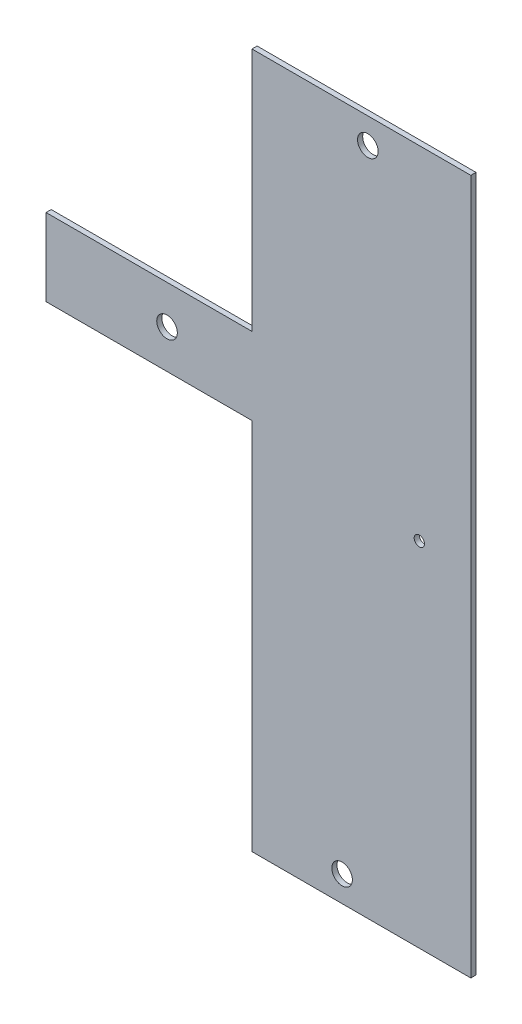
ISO-10303-21;
HEADER;
FILE_DESCRIPTION(('STEP AP214'),'2;1');
FILE_NAME('part.step','',(''),(''),'','','');
FILE_SCHEMA(('AUTOMOTIVE_DESIGN { 1 0 10303 214 1 1 1 1 }'));
ENDSEC;
DATA;
#1=APPLICATION_CONTEXT('core data for automotive mechanical design processes');
#2=APPLICATION_PROTOCOL_DEFINITION('international standard','automotive_design',2000,#1);
#3=PRODUCT_CONTEXT('',#1,'mechanical');
#4=PRODUCT('Part','Part','',(#3));
#5=PRODUCT_RELATED_PRODUCT_CATEGORY('part','',(#4));
#6=PRODUCT_DEFINITION_FORMATION('','',#4);
#7=PRODUCT_DEFINITION_CONTEXT('part definition',#1,'design');
#8=PRODUCT_DEFINITION('design','',#6,#7);
#9=PRODUCT_DEFINITION_SHAPE('','',#8);
#10=(LENGTH_UNIT() NAMED_UNIT(*) SI_UNIT(.MILLI.,.METRE.));
#11=(NAMED_UNIT(*) PLANE_ANGLE_UNIT() SI_UNIT($,.RADIAN.));
#12=(NAMED_UNIT(*) SI_UNIT($,.STERADIAN.) SOLID_ANGLE_UNIT());
#13=UNCERTAINTY_MEASURE_WITH_UNIT(LENGTH_MEASURE(1.E-05),#10,'distance_accuracy_value','');
#14=(GEOMETRIC_REPRESENTATION_CONTEXT(3) GLOBAL_UNCERTAINTY_ASSIGNED_CONTEXT((#13)) GLOBAL_UNIT_ASSIGNED_CONTEXT((#10,
#11,#12)) REPRESENTATION_CONTEXT('',''));
#15=CARTESIAN_POINT('',(0.,0.,0.));
#16=DIRECTION('',(0.,0.,1.));
#17=DIRECTION('',(1.,0.,0.));
#18=AXIS2_PLACEMENT_3D('',#15,#16,#17);
#19=CARTESIAN_POINT('',(-70.0488024936977,-15.3968397565747,2.));
#20=DIRECTION('',(1.,0.,0.));
#21=DIRECTION('',(0.,0.,-1.));
#22=AXIS2_PLACEMENT_3D('',#19,#20,#21);
#23=PLANE('',#22);
#24=DIRECTION('',(0.,-1.,0.));
#25=VECTOR('',#24,1.);
#26=CARTESIAN_POINT('',(-70.0488024936977,-15.3968397565747,0.));
#27=LINE('',#26,#25);
#28=CARTESIAN_POINT('',(-70.0488024936977,14.6031602434253,0.));
#29=VERTEX_POINT('',#28);
#30=CARTESIAN_POINT('',(-70.0488024936977,-15.3968397565747,0.));
#31=VERTEX_POINT('',#30);
#32=EDGE_CURVE('E129',#29,#31,#27,.T.);
#33=ORIENTED_EDGE('',*,*,#32,.T.);
#34=DIRECTION('',(0.,0.,-1.));
#35=VECTOR('',#34,1.);
#36=CARTESIAN_POINT('',(-70.0488024936977,-15.3968397565747,2.));
#37=LINE('',#36,#35);
#38=CARTESIAN_POINT('',(-70.0488024936977,-15.3968397565747,2.));
#39=VERTEX_POINT('',#38);
#40=EDGE_CURVE('E11',#39,#31,#37,.T.);
#41=ORIENTED_EDGE('',*,*,#40,.F.);
#42=DIRECTION('',(0.,-1.,0.));
#43=VECTOR('',#42,1.);
#44=CARTESIAN_POINT('',(-70.0488024936977,-15.3968397565747,2.));
#45=LINE('',#44,#43);
#46=CARTESIAN_POINT('',(-70.0488024936977,14.6031602434253,2.));
#47=VERTEX_POINT('',#46);
#48=EDGE_CURVE('E144',#47,#39,#45,.T.);
#49=ORIENTED_EDGE('',*,*,#48,.F.);
#50=DIRECTION('',(0.,0.,-1.));
#51=VECTOR('',#50,1.);
#52=CARTESIAN_POINT('',(-70.0488024936977,14.6031602434253,2.));
#53=LINE('',#52,#51);
#54=EDGE_CURVE('E125',#47,#29,#53,.T.);
#55=ORIENTED_EDGE('',*,*,#54,.T.);
#56=EDGE_LOOP('',(#33,#41,#49,#55));
#57=FACE_BOUND('',#56,.T.);
#58=ADVANCED_FACE('F33',(#57),#23,.F.);
#59=CARTESIAN_POINT('',(9.95119750630227,-15.3968397565747,2.));
#60=DIRECTION('',(0.,1.,0.));
#61=DIRECTION('',(-1.,0.,0.));
#62=AXIS2_PLACEMENT_3D('',#59,#60,#61);
#63=PLANE('',#62);
#64=DIRECTION('',(1.,0.,0.));
#65=VECTOR('',#64,1.);
#66=CARTESIAN_POINT('',(9.95119750630227,-15.3968397565747,0.));
#67=LINE('',#66,#65);
#68=CARTESIAN_POINT('',(9.95119750630227,-15.3968397565747,0.));
#69=VERTEX_POINT('',#68);
#70=EDGE_CURVE('E132',#31,#69,#67,.T.);
#71=ORIENTED_EDGE('',*,*,#70,.T.);
#72=DIRECTION('',(0.,0.,-1.));
#73=VECTOR('',#72,1.);
#74=CARTESIAN_POINT('',(9.95119750630227,-15.3968397565747,2.));
#75=LINE('',#74,#73);
#76=CARTESIAN_POINT('',(9.95119750630227,-15.3968397565747,2.));
#77=VERTEX_POINT('',#76);
#78=EDGE_CURVE('E41',#77,#69,#75,.T.);
#79=ORIENTED_EDGE('',*,*,#78,.F.);
#80=DIRECTION('',(1.,0.,0.));
#81=VECTOR('',#80,1.);
#82=CARTESIAN_POINT('',(9.95119750630227,-15.3968397565747,2.));
#83=LINE('',#82,#81);
#84=EDGE_CURVE('E92',#39,#77,#83,.T.);
#85=ORIENTED_EDGE('',*,*,#84,.F.);
#86=ORIENTED_EDGE('',*,*,#40,.T.);
#87=EDGE_LOOP('',(#71,#79,#85,#86));
#88=FACE_BOUND('',#87,.T.);
#89=ADVANCED_FACE('F232',(#88),#63,.F.);
#90=CARTESIAN_POINT('',(9.95119750630227,-160.396839756575,2.));
#91=DIRECTION('',(1.,0.,0.));
#92=DIRECTION('',(0.,0.,-1.));
#93=AXIS2_PLACEMENT_3D('',#90,#91,#92);
#94=PLANE('',#93);
#95=DIRECTION('',(0.,-1.,0.));
#96=VECTOR('',#95,1.);
#97=CARTESIAN_POINT('',(9.95119750630227,-160.396839756575,0.));
#98=LINE('',#97,#96);
#99=CARTESIAN_POINT('',(9.95119750630227,-160.396839756575,0.));
#100=VERTEX_POINT('',#99);
#101=EDGE_CURVE('E135',#69,#100,#98,.T.);
#102=ORIENTED_EDGE('',*,*,#101,.T.);
#103=DIRECTION('',(0.,0.,-1.));
#104=VECTOR('',#103,1.);
#105=CARTESIAN_POINT('',(9.95119750630227,-160.396839756575,2.));
#106=LINE('',#105,#104);
#107=CARTESIAN_POINT('',(9.95119750630227,-160.396839756575,2.));
#108=VERTEX_POINT('',#107);
#109=EDGE_CURVE('E151',#108,#100,#106,.T.);
#110=ORIENTED_EDGE('',*,*,#109,.F.);
#111=DIRECTION('',(0.,-1.,0.));
#112=VECTOR('',#111,1.);
#113=CARTESIAN_POINT('',(9.95119750630227,-160.396839756575,2.));
#114=LINE('',#113,#112);
#115=EDGE_CURVE('E159',#77,#108,#114,.T.);
#116=ORIENTED_EDGE('',*,*,#115,.F.);
#117=ORIENTED_EDGE('',*,*,#78,.T.);
#118=EDGE_LOOP('',(#102,#110,#116,#117));
#119=FACE_BOUND('',#118,.T.);
#120=ADVANCED_FACE('F157',(#119),#94,.F.);
#121=CARTESIAN_POINT('',(94.9511975063023,-160.396839756575,2.));
#122=DIRECTION('',(0.,1.,0.));
#123=DIRECTION('',(0.,0.,1.));
#124=AXIS2_PLACEMENT_3D('',#121,#122,#123);
#125=PLANE('',#124);
#126=DIRECTION('',(1.,0.,0.));
#127=VECTOR('',#126,1.);
#128=CARTESIAN_POINT('',(94.9511975063023,-160.396839756575,0.));
#129=LINE('',#128,#127);
#130=CARTESIAN_POINT('',(94.9511975063023,-160.396839756575,0.));
#131=VERTEX_POINT('',#130);
#132=EDGE_CURVE('E137',#100,#131,#129,.T.);
#133=ORIENTED_EDGE('',*,*,#132,.T.);
#134=DIRECTION('',(0.,0.,-1.));
#135=VECTOR('',#134,1.);
#136=CARTESIAN_POINT('',(94.9511975063023,-160.396839756575,2.));
#137=LINE('',#136,#135);
#138=CARTESIAN_POINT('',(94.9511975063023,-160.396839756575,2.));
#139=VERTEX_POINT('',#138);
#140=EDGE_CURVE('E148',#139,#131,#137,.T.);
#141=ORIENTED_EDGE('',*,*,#140,.F.);
#142=DIRECTION('',(1.,0.,0.));
#143=VECTOR('',#142,1.);
#144=CARTESIAN_POINT('',(94.9511975063023,-160.396839756575,2.));
#145=LINE('',#144,#143);
#146=EDGE_CURVE('E171',#108,#139,#145,.T.);
#147=ORIENTED_EDGE('',*,*,#146,.F.);
#148=ORIENTED_EDGE('',*,*,#109,.T.);
#149=EDGE_LOOP('',(#133,#141,#147,#148));
#150=FACE_BOUND('',#149,.T.);
#151=ADVANCED_FACE('F167',(#150),#125,.F.);
#152=CARTESIAN_POINT('',(94.9511975063023,109.603160243425,2.));
#153=DIRECTION('',(-1.,0.,0.));
#154=DIRECTION('',(0.,-1.,0.));
#155=AXIS2_PLACEMENT_3D('',#152,#153,#154);
#156=PLANE('',#155);
#157=DIRECTION('',(0.,1.,0.));
#158=VECTOR('',#157,1.);
#159=CARTESIAN_POINT('',(94.9511975063023,109.603160243425,0.));
#160=LINE('',#159,#158);
#161=CARTESIAN_POINT('',(94.9511975063023,109.603160243425,0.));
#162=VERTEX_POINT('',#161);
#163=EDGE_CURVE('E139',#131,#162,#160,.T.);
#164=ORIENTED_EDGE('',*,*,#163,.T.);
#165=DIRECTION('',(0.,0.,-1.));
#166=VECTOR('',#165,1.);
#167=CARTESIAN_POINT('',(94.9511975063023,109.603160243425,2.));
#168=LINE('',#167,#166);
#169=CARTESIAN_POINT('',(94.9511975063023,109.603160243425,2.));
#170=VERTEX_POINT('',#169);
#171=EDGE_CURVE('E120',#170,#162,#168,.T.);
#172=ORIENTED_EDGE('',*,*,#171,.F.);
#173=DIRECTION('',(0.,1.,0.));
#174=VECTOR('',#173,1.);
#175=CARTESIAN_POINT('',(94.9511975063023,109.603160243425,2.));
#176=LINE('',#175,#174);
#177=EDGE_CURVE('E111',#139,#170,#176,.T.);
#178=ORIENTED_EDGE('',*,*,#177,.F.);
#179=ORIENTED_EDGE('',*,*,#140,.T.);
#180=EDGE_LOOP('',(#164,#172,#178,#179));
#181=FACE_BOUND('',#180,.T.);
#182=ADVANCED_FACE('F170',(#181),#156,.F.);
#183=CARTESIAN_POINT('',(9.95119750630227,109.603160243425,2.));
#184=DIRECTION('',(0.,-1.,0.));
#185=DIRECTION('',(0.,0.,-1.));
#186=AXIS2_PLACEMENT_3D('',#183,#184,#185);
#187=PLANE('',#186);
#188=DIRECTION('',(-1.,0.,0.));
#189=VECTOR('',#188,1.);
#190=CARTESIAN_POINT('',(9.95119750630227,109.603160243425,0.));
#191=LINE('',#190,#189);
#192=CARTESIAN_POINT('',(9.95119750630227,109.603160243425,0.));
#193=VERTEX_POINT('',#192);
#194=EDGE_CURVE('E119',#162,#193,#191,.T.);
#195=ORIENTED_EDGE('',*,*,#194,.T.);
#196=DIRECTION('',(0.,0.,-1.));
#197=VECTOR('',#196,1.);
#198=CARTESIAN_POINT('',(9.95119750630227,109.603160243425,2.));
#199=LINE('',#198,#197);
#200=CARTESIAN_POINT('',(9.95119750630227,109.603160243425,2.));
#201=VERTEX_POINT('',#200);
#202=EDGE_CURVE('E116',#201,#193,#199,.T.);
#203=ORIENTED_EDGE('',*,*,#202,.F.);
#204=DIRECTION('',(-1.,0.,0.));
#205=VECTOR('',#204,1.);
#206=CARTESIAN_POINT('',(9.95119750630227,109.603160243425,2.));
#207=LINE('',#206,#205);
#208=EDGE_CURVE('E105',#170,#201,#207,.T.);
#209=ORIENTED_EDGE('',*,*,#208,.F.);
#210=ORIENTED_EDGE('',*,*,#171,.T.);
#211=EDGE_LOOP('',(#195,#203,#209,#210));
#212=FACE_BOUND('',#211,.T.);
#213=ADVANCED_FACE('F117',(#212),#187,.F.);
#214=CARTESIAN_POINT('',(9.95119750630227,14.6031602434253,2.));
#215=DIRECTION('',(1.,0.,0.));
#216=DIRECTION('',(0.,0.,-1.));
#217=AXIS2_PLACEMENT_3D('',#214,#215,#216);
#218=PLANE('',#217);
#219=DIRECTION('',(0.,-1.,0.));
#220=VECTOR('',#219,1.);
#221=CARTESIAN_POINT('',(9.95119750630227,14.6031602434253,0.));
#222=LINE('',#221,#220);
#223=CARTESIAN_POINT('',(9.95119750630227,14.6031602434253,0.));
#224=VERTEX_POINT('',#223);
#225=EDGE_CURVE('E78',#193,#224,#222,.T.);
#226=ORIENTED_EDGE('',*,*,#225,.T.);
#227=DIRECTION('',(0.,0.,-1.));
#228=VECTOR('',#227,1.);
#229=CARTESIAN_POINT('',(9.95119750630227,14.6031602434253,2.));
#230=LINE('',#229,#228);
#231=CARTESIAN_POINT('',(9.95119750630227,14.6031602434253,2.));
#232=VERTEX_POINT('',#231);
#233=EDGE_CURVE('E121',#232,#224,#230,.T.);
#234=ORIENTED_EDGE('',*,*,#233,.F.);
#235=DIRECTION('',(0.,-1.,0.));
#236=VECTOR('',#235,1.);
#237=CARTESIAN_POINT('',(9.95119750630227,14.6031602434253,2.));
#238=LINE('',#237,#236);
#239=EDGE_CURVE('E109',#201,#232,#238,.T.);
#240=ORIENTED_EDGE('',*,*,#239,.F.);
#241=ORIENTED_EDGE('',*,*,#202,.T.);
#242=EDGE_LOOP('',(#226,#234,#240,#241));
#243=FACE_BOUND('',#242,.T.);
#244=ADVANCED_FACE('F123',(#243),#218,.F.);
#245=CARTESIAN_POINT('',(-70.0488024936977,14.6031602434253,2.));
#246=DIRECTION('',(0.,-1.,0.));
#247=DIRECTION('',(0.,0.,-1.));
#248=AXIS2_PLACEMENT_3D('',#245,#246,#247);
#249=PLANE('',#248);
#250=DIRECTION('',(-1.,0.,0.));
#251=VECTOR('',#250,1.);
#252=CARTESIAN_POINT('',(-70.0488024936977,14.6031602434253,0.));
#253=LINE('',#252,#251);
#254=EDGE_CURVE('E84',#224,#29,#253,.T.);
#255=ORIENTED_EDGE('',*,*,#254,.T.);
#256=ORIENTED_EDGE('',*,*,#54,.F.);
#257=DIRECTION('',(-1.,0.,0.));
#258=VECTOR('',#257,1.);
#259=CARTESIAN_POINT('',(-70.0488024936977,14.6031602434253,2.));
#260=LINE('',#259,#258);
#261=EDGE_CURVE('E49',#232,#47,#260,.T.);
#262=ORIENTED_EDGE('',*,*,#261,.F.);
#263=ORIENTED_EDGE('',*,*,#233,.T.);
#264=EDGE_LOOP('',(#255,#256,#262,#263));
#265=FACE_BOUND('',#264,.T.);
#266=ADVANCED_FACE('F239',(#265),#249,.F.);
#267=CARTESIAN_POINT('',(-70.0488024936977,14.6031602434253,2.));
#268=DIRECTION('',(0.,0.,-1.));
#269=DIRECTION('',(-1.,0.,0.));
#270=AXIS2_PLACEMENT_3D('',#267,#268,#269);
#271=PLANE('',#270);
#272=CARTESIAN_POINT('',(44.9511975063023,-150.396839756575,2.));
#273=DIRECTION('',(0.,0.,-1.));
#274=DIRECTION('',(-1.,0.,0.));
#275=AXIS2_PLACEMENT_3D('',#272,#273,#274);
#276=CIRCLE('',#275,4.00000000000001);
#277=CARTESIAN_POINT('',(40.9511975063023,-150.396839756575,2.));
#278=VERTEX_POINT('',#277);
#279=EDGE_CURVE('E192',#278,#278,#276,.T.);
#280=ORIENTED_EDGE('',*,*,#279,.T.);
#281=EDGE_LOOP('',(#280));
#282=FACE_BOUND('',#281,.T.);
#283=CARTESIAN_POINT('',(74.9512975063023,-23.3968397565747,2.));
#284=DIRECTION('',(0.,0.,-1.));
#285=DIRECTION('',(-1.,0.,0.));
#286=AXIS2_PLACEMENT_3D('',#283,#284,#285);
#287=CIRCLE('',#286,2.00000000000001);
#288=CARTESIAN_POINT('',(72.9512975063023,-23.3968397565747,2.));
#289=VERTEX_POINT('',#288);
#290=EDGE_CURVE('E186',#289,#289,#287,.T.);
#291=ORIENTED_EDGE('',*,*,#290,.T.);
#292=EDGE_LOOP('',(#291));
#293=FACE_BOUND('',#292,.T.);
#294=CARTESIAN_POINT('',(-23.0488024936977,-0.396839756574743,2.));
#295=DIRECTION('',(0.,0.,-1.));
#296=DIRECTION('',(-1.,0.,0.));
#297=AXIS2_PLACEMENT_3D('',#294,#295,#296);
#298=CIRCLE('',#297,4.);
#299=CARTESIAN_POINT('',(-27.0488024936977,-0.396839756574743,2.));
#300=VERTEX_POINT('',#299);
#301=EDGE_CURVE('E180',#300,#300,#298,.T.);
#302=ORIENTED_EDGE('',*,*,#301,.T.);
#303=EDGE_LOOP('',(#302));
#304=FACE_BOUND('',#303,.T.);
#305=CARTESIAN_POINT('',(54.9511975063023,99.6031602434253,2.));
#306=DIRECTION('',(0.,0.,-1.));
#307=DIRECTION('',(-1.,0.,0.));
#308=AXIS2_PLACEMENT_3D('',#305,#306,#307);
#309=CIRCLE('',#308,4.);
#310=CARTESIAN_POINT('',(50.9511975063023,99.6031602434253,2.));
#311=VERTEX_POINT('',#310);
#312=EDGE_CURVE('E133',#311,#311,#309,.T.);
#313=ORIENTED_EDGE('',*,*,#312,.T.);
#314=EDGE_LOOP('',(#313));
#315=FACE_BOUND('',#314,.T.);
#316=ORIENTED_EDGE('',*,*,#48,.T.);
#317=ORIENTED_EDGE('',*,*,#84,.T.);
#318=ORIENTED_EDGE('',*,*,#115,.T.);
#319=ORIENTED_EDGE('',*,*,#146,.T.);
#320=ORIENTED_EDGE('',*,*,#177,.T.);
#321=ORIENTED_EDGE('',*,*,#208,.T.);
#322=ORIENTED_EDGE('',*,*,#239,.T.);
#323=ORIENTED_EDGE('',*,*,#261,.T.);
#324=EDGE_LOOP('',(#316,#317,#318,#319,#320,#321,#322,#323));
#325=FACE_BOUND('',#324,.T.);
#326=ADVANCED_FACE('F107',(#282,#293,#304,#315,#325),#271,.F.);
#327=CARTESIAN_POINT('',(-70.0488024936977,14.6031602434253,0.));
#328=DIRECTION('',(0.,0.,-1.));
#329=DIRECTION('',(-1.,0.,0.));
#330=AXIS2_PLACEMENT_3D('',#327,#328,#329);
#331=PLANE('',#330);
#332=CARTESIAN_POINT('',(44.9511975063023,-150.396839756575,0.));
#333=DIRECTION('',(0.,0.,-1.));
#334=DIRECTION('',(-1.,0.,0.));
#335=AXIS2_PLACEMENT_3D('',#332,#333,#334);
#336=CIRCLE('',#335,4.00000000000001);
#337=CARTESIAN_POINT('',(40.9511975063023,-150.396839756575,0.));
#338=VERTEX_POINT('',#337);
#339=EDGE_CURVE('E195',#338,#338,#336,.T.);
#340=ORIENTED_EDGE('',*,*,#339,.F.);
#341=EDGE_LOOP('',(#340));
#342=FACE_BOUND('',#341,.T.);
#343=CARTESIAN_POINT('',(74.9512975063023,-23.3968397565747,0.));
#344=DIRECTION('',(0.,0.,-1.));
#345=DIRECTION('',(-1.,0.,0.));
#346=AXIS2_PLACEMENT_3D('',#343,#344,#345);
#347=CIRCLE('',#346,2.00000000000001);
#348=CARTESIAN_POINT('',(72.9512975063023,-23.3968397565747,0.));
#349=VERTEX_POINT('',#348);
#350=EDGE_CURVE('E189',#349,#349,#347,.T.);
#351=ORIENTED_EDGE('',*,*,#350,.F.);
#352=EDGE_LOOP('',(#351));
#353=FACE_BOUND('',#352,.T.);
#354=CARTESIAN_POINT('',(-23.0488024936977,-0.396839756574743,0.));
#355=DIRECTION('',(0.,0.,-1.));
#356=DIRECTION('',(-1.,0.,0.));
#357=AXIS2_PLACEMENT_3D('',#354,#355,#356);
#358=CIRCLE('',#357,4.);
#359=CARTESIAN_POINT('',(-27.0488024936977,-0.396839756574743,0.));
#360=VERTEX_POINT('',#359);
#361=EDGE_CURVE('E183',#360,#360,#358,.T.);
#362=ORIENTED_EDGE('',*,*,#361,.F.);
#363=EDGE_LOOP('',(#362));
#364=FACE_BOUND('',#363,.T.);
#365=CARTESIAN_POINT('',(54.9511975063023,99.6031602434253,0.));
#366=DIRECTION('',(0.,0.,-1.));
#367=DIRECTION('',(-1.,0.,0.));
#368=AXIS2_PLACEMENT_3D('',#365,#366,#367);
#369=CIRCLE('',#368,4.);
#370=CARTESIAN_POINT('',(50.9511975063023,99.6031602434253,0.));
#371=VERTEX_POINT('',#370);
#372=EDGE_CURVE('E177',#371,#371,#369,.T.);
#373=ORIENTED_EDGE('',*,*,#372,.F.);
#374=EDGE_LOOP('',(#373));
#375=FACE_BOUND('',#374,.T.);
#376=ORIENTED_EDGE('',*,*,#32,.F.);
#377=ORIENTED_EDGE('',*,*,#254,.F.);
#378=ORIENTED_EDGE('',*,*,#225,.F.);
#379=ORIENTED_EDGE('',*,*,#194,.F.);
#380=ORIENTED_EDGE('',*,*,#163,.F.);
#381=ORIENTED_EDGE('',*,*,#132,.F.);
#382=ORIENTED_EDGE('',*,*,#101,.F.);
#383=ORIENTED_EDGE('',*,*,#70,.F.);
#384=EDGE_LOOP('',(#376,#377,#378,#379,#380,#381,#382,#383));
#385=FACE_BOUND('',#384,.T.);
#386=ADVANCED_FACE('F163',(#342,#353,#364,#375,#385),#331,.T.);
#387=CARTESIAN_POINT('',(54.9511975063023,99.6031602434253,2.));
#388=DIRECTION('',(0.,0.,-1.));
#389=DIRECTION('',(-1.,0.,0.));
#390=AXIS2_PLACEMENT_3D('',#387,#388,#389);
#391=CYLINDRICAL_SURFACE('',#390,4.);
#392=ORIENTED_EDGE('',*,*,#312,.F.);
#393=EDGE_LOOP('',(#392));
#394=FACE_BOUND('',#393,.T.);
#395=ORIENTED_EDGE('',*,*,#372,.T.);
#396=EDGE_LOOP('',(#395));
#397=FACE_BOUND('',#396,.T.);
#398=ADVANCED_FACE('F212',(#394,#397),#391,.F.);
#399=CARTESIAN_POINT('',(-23.0488024936977,-0.396839756574743,2.));
#400=DIRECTION('',(0.,0.,-1.));
#401=DIRECTION('',(-1.,0.,0.));
#402=AXIS2_PLACEMENT_3D('',#399,#400,#401);
#403=CYLINDRICAL_SURFACE('',#402,4.);
#404=ORIENTED_EDGE('',*,*,#301,.F.);
#405=EDGE_LOOP('',(#404));
#406=FACE_BOUND('',#405,.T.);
#407=ORIENTED_EDGE('',*,*,#361,.T.);
#408=EDGE_LOOP('',(#407));
#409=FACE_BOUND('',#408,.T.);
#410=ADVANCED_FACE('F221',(#406,#409),#403,.F.);
#411=CARTESIAN_POINT('',(74.9512975063023,-23.3968397565747,2.));
#412=DIRECTION('',(0.,0.,-1.));
#413=DIRECTION('',(-1.,0.,0.));
#414=AXIS2_PLACEMENT_3D('',#411,#412,#413);
#415=CYLINDRICAL_SURFACE('',#414,2.00000000000001);
#416=ORIENTED_EDGE('',*,*,#290,.F.);
#417=EDGE_LOOP('',(#416));
#418=FACE_BOUND('',#417,.T.);
#419=ORIENTED_EDGE('',*,*,#350,.T.);
#420=EDGE_LOOP('',(#419));
#421=FACE_BOUND('',#420,.T.);
#422=ADVANCED_FACE('F206',(#418,#421),#415,.F.);
#423=CARTESIAN_POINT('',(44.9511975063023,-150.396839756575,2.));
#424=DIRECTION('',(0.,0.,-1.));
#425=DIRECTION('',(-1.,0.,0.));
#426=AXIS2_PLACEMENT_3D('',#423,#424,#425);
#427=CYLINDRICAL_SURFACE('',#426,4.00000000000001);
#428=ORIENTED_EDGE('',*,*,#279,.F.);
#429=EDGE_LOOP('',(#428));
#430=FACE_BOUND('',#429,.T.);
#431=ORIENTED_EDGE('',*,*,#339,.T.);
#432=EDGE_LOOP('',(#431));
#433=FACE_BOUND('',#432,.T.);
#434=ADVANCED_FACE('F203',(#430,#433),#427,.F.);
#435=CLOSED_SHELL('',(#58,#89,#120,#151,#182,#213,#244,#266,#326,#386,#398,#410,#422,#434));
#436=MANIFOLD_SOLID_BREP('B2',#435);
#437=ADVANCED_BREP_SHAPE_REPRESENTATION('',(#18,#436),#14);
#438=SHAPE_DEFINITION_REPRESENTATION(#9,#437);
ENDSEC;
END-ISO-10303-21;
